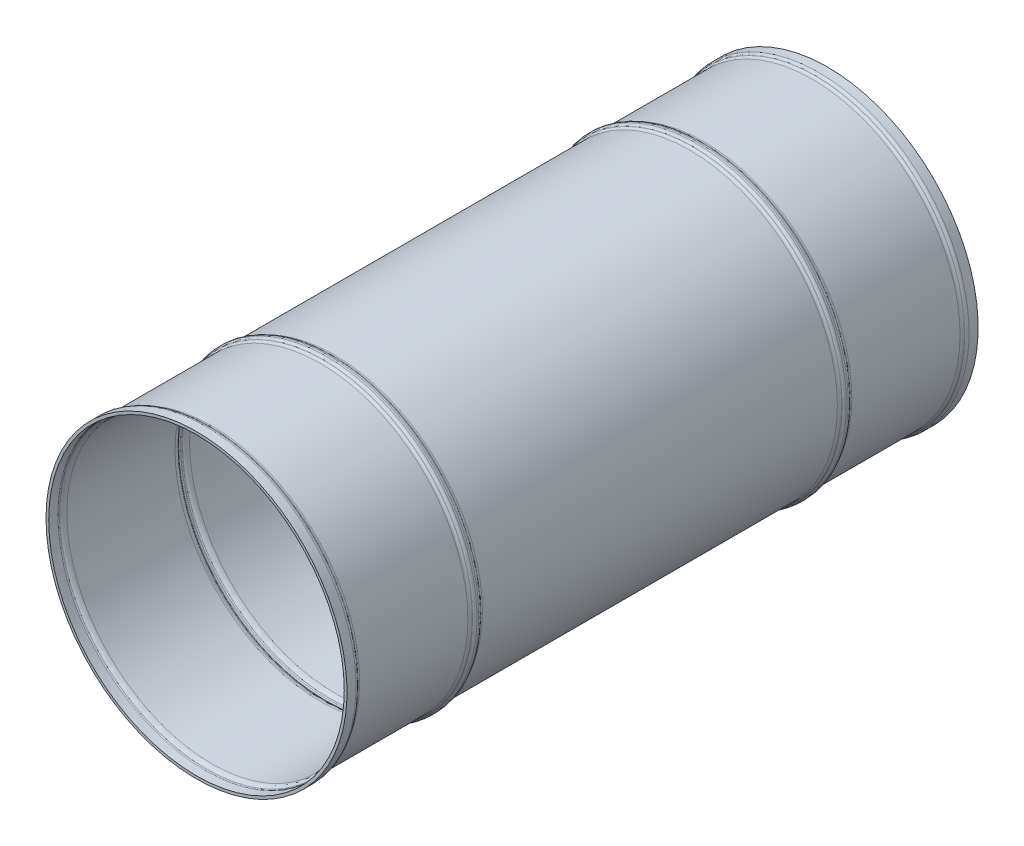
ISO-10303-21;
HEADER;
FILE_DESCRIPTION(('STEP AP214'),'2;1');
FILE_NAME('part.step','',(''),(''),'','','');
FILE_SCHEMA(('AUTOMOTIVE_DESIGN { 1 0 10303 214 1 1 1 1 }'));
ENDSEC;
DATA;
#1=APPLICATION_CONTEXT('core data for automotive mechanical design processes');
#2=APPLICATION_PROTOCOL_DEFINITION('international standard','automotive_design',2000,#1);
#3=PRODUCT_CONTEXT('',#1,'mechanical');
#4=PRODUCT('Part','Part','',(#3));
#5=PRODUCT_RELATED_PRODUCT_CATEGORY('part','',(#4));
#6=PRODUCT_DEFINITION_FORMATION('','',#4);
#7=PRODUCT_DEFINITION_CONTEXT('part definition',#1,'design');
#8=PRODUCT_DEFINITION('design','',#6,#7);
#9=PRODUCT_DEFINITION_SHAPE('','',#8);
#10=(LENGTH_UNIT() NAMED_UNIT(*) SI_UNIT(.MILLI.,.METRE.));
#11=(NAMED_UNIT(*) PLANE_ANGLE_UNIT() SI_UNIT($,.RADIAN.));
#12=(NAMED_UNIT(*) SI_UNIT($,.STERADIAN.) SOLID_ANGLE_UNIT());
#13=UNCERTAINTY_MEASURE_WITH_UNIT(LENGTH_MEASURE(1.E-05),#10,'distance_accuracy_value','');
#14=(GEOMETRIC_REPRESENTATION_CONTEXT(3) GLOBAL_UNCERTAINTY_ASSIGNED_CONTEXT((#13)) GLOBAL_UNIT_ASSIGNED_CONTEXT((#10,
#11,#12)) REPRESENTATION_CONTEXT('',''));
#15=CARTESIAN_POINT('',(0.,0.,0.));
#16=DIRECTION('',(0.,0.,1.));
#17=DIRECTION('',(1.,0.,0.));
#18=AXIS2_PLACEMENT_3D('',#15,#16,#17);
#19=CARTESIAN_POINT('',(0.,27.7,91.0884572681201));
#20=DIRECTION('',(0.,0.,1.));
#21=DIRECTION('',(1.,0.,0.));
#22=AXIS2_PLACEMENT_3D('',#19,#20,#21);
#23=PLANE('',#22);
#24=CARTESIAN_POINT('',(0.,0.,91.0884572681201));
#25=DIRECTION('',(0.,0.,-1.));
#26=DIRECTION('',(-1.,0.,0.));
#27=AXIS2_PLACEMENT_3D('',#24,#25,#26);
#28=CIRCLE('',#27,27.2);
#29=CARTESIAN_POINT('',(-27.2,0.,91.0884572681201));
#30=VERTEX_POINT('',#29);
#31=EDGE_CURVE('E192',#30,#30,#28,.T.);
#32=ORIENTED_EDGE('',*,*,#31,.T.);
#33=EDGE_LOOP('',(#32));
#34=FACE_BOUND('',#33,.T.);
#35=CARTESIAN_POINT('',(0.,0.,91.0884572681201));
#36=DIRECTION('',(0.,0.,-1.));
#37=DIRECTION('',(-1.,0.,0.));
#38=AXIS2_PLACEMENT_3D('',#35,#36,#37);
#39=CIRCLE('',#38,27.7);
#40=CARTESIAN_POINT('',(-27.7,0.,91.0884572681201));
#41=VERTEX_POINT('',#40);
#42=EDGE_CURVE('E10',#41,#41,#39,.T.);
#43=ORIENTED_EDGE('',*,*,#42,.F.);
#44=EDGE_LOOP('',(#43));
#45=FACE_BOUND('',#44,.T.);
#46=ADVANCED_FACE('F32',(#34,#45),#23,.T.);
#47=CARTESIAN_POINT('',(0.,0.,0.));
#48=DIRECTION('',(0.,0.,-1.));
#49=DIRECTION('',(-1.,0.,0.));
#50=AXIS2_PLACEMENT_3D('',#47,#48,#49);
#51=CYLINDRICAL_SURFACE('',#50,27.7);
#52=ORIENTED_EDGE('',*,*,#42,.T.);
#53=EDGE_LOOP('',(#52));
#54=FACE_BOUND('',#53,.T.);
#55=CARTESIAN_POINT('',(0.,0.,89.4198281180186));
#56=DIRECTION('',(0.,0.,-1.));
#57=DIRECTION('',(-1.,0.,0.));
#58=AXIS2_PLACEMENT_3D('',#55,#56,#57);
#59=CIRCLE('',#58,27.7);
#60=CARTESIAN_POINT('',(-27.7,0.,89.4198281180186));
#61=VERTEX_POINT('',#60);
#62=EDGE_CURVE('E38',#61,#61,#59,.T.);
#63=ORIENTED_EDGE('',*,*,#62,.F.);
#64=EDGE_LOOP('',(#63));
#65=FACE_BOUND('',#64,.T.);
#66=ADVANCED_FACE('F210',(#54,#65),#51,.T.);
#67=CARTESIAN_POINT('',(0.,0.,89.4198281180186));
#68=DIRECTION('',(0.,0.,-1.));
#69=DIRECTION('',(-1.,0.,0.));
#70=AXIS2_PLACEMENT_3D('',#67,#68,#69);
#71=TOROIDAL_SURFACE('',#70,26.9,0.799999999999999);
#72=ORIENTED_EDGE('',*,*,#62,.T.);
#73=EDGE_LOOP('',(#72));
#74=FACE_BOUND('',#73,.T.);
#75=CARTESIAN_POINT('',(0.,0.,88.8541426930694));
#76=DIRECTION('',(0.,0.,-1.));
#77=DIRECTION('',(-1.,0.,0.));
#78=AXIS2_PLACEMENT_3D('',#75,#76,#77);
#79=CIRCLE('',#78,27.4656854249492);
#80=CARTESIAN_POINT('',(-27.4656854249492,0.,88.8541426930694));
#81=VERTEX_POINT('',#80);
#82=EDGE_CURVE('E42',#81,#81,#79,.T.);
#83=ORIENTED_EDGE('',*,*,#82,.F.);
#84=EDGE_LOOP('',(#83));
#85=FACE_BOUND('',#84,.T.);
#86=ADVANCED_FACE('F214',(#74,#85),#71,.T.);
#87=CARTESIAN_POINT('',(0.,0.,88.8227718431709));
#88=DIRECTION('',(0.,0.,1.));
#89=DIRECTION('',(1.,0.,0.));
#90=AXIS2_PLACEMENT_3D('',#87,#88,#89);
#91=CONICAL_SURFACE('',#90,27.4343145750507,0.785398163397338);
#92=ORIENTED_EDGE('',*,*,#82,.T.);
#93=EDGE_LOOP('',(#92));
#94=FACE_BOUND('',#93,.T.);
#95=CARTESIAN_POINT('',(0.,0.,88.8227718431709));
#96=DIRECTION('',(0.,0.,-1.));
#97=DIRECTION('',(-1.,0.,0.));
#98=AXIS2_PLACEMENT_3D('',#95,#96,#97);
#99=CIRCLE('',#98,27.4343145750507);
#100=CARTESIAN_POINT('',(-27.4343145750507,0.,88.8227718431709));
#101=VERTEX_POINT('',#100);
#102=EDGE_CURVE('E46',#101,#101,#99,.T.);
#103=ORIENTED_EDGE('',*,*,#102,.F.);
#104=EDGE_LOOP('',(#103));
#105=FACE_BOUND('',#104,.T.);
#106=ADVANCED_FACE('F218',(#94,#105),#91,.T.);
#107=CARTESIAN_POINT('',(0.,0.,88.2570864182216));
#108=DIRECTION('',(0.,0.,-1.));
#109=DIRECTION('',(-1.,0.,0.));
#110=AXIS2_PLACEMENT_3D('',#107,#108,#109);
#111=TOROIDAL_SURFACE('',#110,28.,0.799999999999996);
#112=ORIENTED_EDGE('',*,*,#102,.T.);
#113=EDGE_LOOP('',(#112));
#114=FACE_BOUND('',#113,.T.);
#115=CARTESIAN_POINT('',(0.,0.,88.2570864182216));
#116=DIRECTION('',(0.,0.,-1.));
#117=DIRECTION('',(-1.,0.,0.));
#118=AXIS2_PLACEMENT_3D('',#115,#116,#117);
#119=CIRCLE('',#118,27.2);
#120=CARTESIAN_POINT('',(-27.2,0.,88.2570864182216));
#121=VERTEX_POINT('',#120);
#122=EDGE_CURVE('E51',#121,#121,#119,.T.);
#123=ORIENTED_EDGE('',*,*,#122,.F.);
#124=EDGE_LOOP('',(#123));
#125=FACE_BOUND('',#124,.T.);
#126=ADVANCED_FACE('F224',(#114,#125),#111,.F.);
#127=CARTESIAN_POINT('',(0.,0.,0.));
#128=DIRECTION('',(0.,0.,-1.));
#129=DIRECTION('',(-1.,0.,0.));
#130=AXIS2_PLACEMENT_3D('',#127,#128,#129);
#131=CYLINDRICAL_SURFACE('',#130,27.2);
#132=ORIENTED_EDGE('',*,*,#122,.T.);
#133=EDGE_LOOP('',(#132));
#134=FACE_BOUND('',#133,.T.);
#135=CARTESIAN_POINT('',(0.,0.,68.3313708498985));
#136=DIRECTION('',(0.,0.,-1.));
#137=DIRECTION('',(-1.,0.,0.));
#138=AXIS2_PLACEMENT_3D('',#135,#136,#137);
#139=CIRCLE('',#138,27.2);
#140=CARTESIAN_POINT('',(-27.2,0.,68.3313708498985));
#141=VERTEX_POINT('',#140);
#142=EDGE_CURVE('E54',#141,#141,#139,.T.);
#143=ORIENTED_EDGE('',*,*,#142,.F.);
#144=EDGE_LOOP('',(#143));
#145=FACE_BOUND('',#144,.T.);
#146=ADVANCED_FACE('F228',(#134,#145),#131,.T.);
#147=CARTESIAN_POINT('',(0.,0.,68.3313708498985));
#148=DIRECTION('',(0.,0.,-1.));
#149=DIRECTION('',(-1.,0.,0.));
#150=AXIS2_PLACEMENT_3D('',#147,#148,#149);
#151=TOROIDAL_SURFACE('',#150,28.,0.800000000000001);
#152=ORIENTED_EDGE('',*,*,#142,.T.);
#153=EDGE_LOOP('',(#152));
#154=FACE_BOUND('',#153,.T.);
#155=CARTESIAN_POINT('',(0.,0.,67.7656854249492));
#156=DIRECTION('',(0.,0.,-1.));
#157=DIRECTION('',(-1.,0.,0.));
#158=AXIS2_PLACEMENT_3D('',#155,#156,#157);
#159=CIRCLE('',#158,27.4343145750508);
#160=CARTESIAN_POINT('',(-27.4343145750508,0.,67.7656854249492));
#161=VERTEX_POINT('',#160);
#162=EDGE_CURVE('E57',#161,#161,#159,.T.);
#163=ORIENTED_EDGE('',*,*,#162,.F.);
#164=EDGE_LOOP('',(#163));
#165=FACE_BOUND('',#164,.T.);
#166=ADVANCED_FACE('F232',(#154,#165),#151,.F.);
#167=CARTESIAN_POINT('',(0.,0.,67.7343145750508));
#168=DIRECTION('',(0.,0.,-1.));
#169=DIRECTION('',(-1.,0.,0.));
#170=AXIS2_PLACEMENT_3D('',#167,#168,#169);
#171=CONICAL_SURFACE('',#170,27.4656854249492,0.785398163397448);
#172=ORIENTED_EDGE('',*,*,#162,.T.);
#173=EDGE_LOOP('',(#172));
#174=FACE_BOUND('',#173,.T.);
#175=CARTESIAN_POINT('',(0.,0.,67.7343145750508));
#176=DIRECTION('',(0.,0.,-1.));
#177=DIRECTION('',(-1.,0.,0.));
#178=AXIS2_PLACEMENT_3D('',#175,#176,#177);
#179=CIRCLE('',#178,27.4656854249492);
#180=CARTESIAN_POINT('',(-27.4656854249492,0.,67.7343145750508));
#181=VERTEX_POINT('',#180);
#182=EDGE_CURVE('E60',#181,#181,#179,.T.);
#183=ORIENTED_EDGE('',*,*,#182,.F.);
#184=EDGE_LOOP('',(#183));
#185=FACE_BOUND('',#184,.T.);
#186=ADVANCED_FACE('F236',(#174,#185),#171,.T.);
#187=CARTESIAN_POINT('',(0.,0.,67.1686291501015));
#188=DIRECTION('',(0.,0.,-1.));
#189=DIRECTION('',(-1.,0.,0.));
#190=AXIS2_PLACEMENT_3D('',#187,#188,#189);
#191=TOROIDAL_SURFACE('',#190,26.9,0.799999999999999);
#192=ORIENTED_EDGE('',*,*,#182,.T.);
#193=EDGE_LOOP('',(#192));
#194=FACE_BOUND('',#193,.T.);
#195=CARTESIAN_POINT('',(0.,0.,67.1686291501015));
#196=DIRECTION('',(0.,0.,-1.));
#197=DIRECTION('',(-1.,0.,0.));
#198=AXIS2_PLACEMENT_3D('',#195,#196,#197);
#199=CIRCLE('',#198,27.7);
#200=CARTESIAN_POINT('',(-27.7,0.,67.1686291501015));
#201=VERTEX_POINT('',#200);
#202=EDGE_CURVE('E63',#201,#201,#199,.T.);
#203=ORIENTED_EDGE('',*,*,#202,.F.);
#204=EDGE_LOOP('',(#203));
#205=FACE_BOUND('',#204,.T.);
#206=ADVANCED_FACE('F240',(#194,#205),#191,.T.);
#207=CARTESIAN_POINT('',(0.,0.,0.));
#208=DIRECTION('',(0.,0.,-1.));
#209=DIRECTION('',(-1.,0.,0.));
#210=AXIS2_PLACEMENT_3D('',#207,#208,#209);
#211=CYLINDRICAL_SURFACE('',#210,27.7);
#212=ORIENTED_EDGE('',*,*,#202,.T.);
#213=EDGE_LOOP('',(#212));
#214=FACE_BOUND('',#213,.T.);
#215=CARTESIAN_POINT('',(0.,0.,66.8313708498985));
#216=DIRECTION('',(0.,0.,-1.));
#217=DIRECTION('',(-1.,0.,0.));
#218=AXIS2_PLACEMENT_3D('',#215,#216,#217);
#219=CIRCLE('',#218,27.7);
#220=CARTESIAN_POINT('',(-27.7,0.,66.8313708498985));
#221=VERTEX_POINT('',#220);
#222=EDGE_CURVE('E66',#221,#221,#219,.T.);
#223=ORIENTED_EDGE('',*,*,#222,.F.);
#224=EDGE_LOOP('',(#223));
#225=FACE_BOUND('',#224,.T.);
#226=ADVANCED_FACE('F244',(#214,#225),#211,.T.);
#227=CARTESIAN_POINT('',(0.,0.,66.8313708498985));
#228=DIRECTION('',(0.,0.,-1.));
#229=DIRECTION('',(-1.,0.,0.));
#230=AXIS2_PLACEMENT_3D('',#227,#228,#229);
#231=TOROIDAL_SURFACE('',#230,26.9,0.799999999999997);
#232=ORIENTED_EDGE('',*,*,#222,.T.);
#233=EDGE_LOOP('',(#232));
#234=FACE_BOUND('',#233,.T.);
#235=CARTESIAN_POINT('',(0.,0.,66.2656854249493));
#236=DIRECTION('',(0.,0.,-1.));
#237=DIRECTION('',(-1.,0.,0.));
#238=AXIS2_PLACEMENT_3D('',#235,#236,#237);
#239=CIRCLE('',#238,27.4656854249492);
#240=CARTESIAN_POINT('',(-27.4656854249492,0.,66.2656854249493));
#241=VERTEX_POINT('',#240);
#242=EDGE_CURVE('E69',#241,#241,#239,.T.);
#243=ORIENTED_EDGE('',*,*,#242,.F.);
#244=EDGE_LOOP('',(#243));
#245=FACE_BOUND('',#244,.T.);
#246=ADVANCED_FACE('F248',(#234,#245),#231,.T.);
#247=CARTESIAN_POINT('',(0.,0.,66.2343145750508));
#248=DIRECTION('',(0.,0.,1.));
#249=DIRECTION('',(1.,0.,0.));
#250=AXIS2_PLACEMENT_3D('',#247,#248,#249);
#251=CONICAL_SURFACE('',#250,27.4343145750507,0.785398163397338);
#252=ORIENTED_EDGE('',*,*,#242,.T.);
#253=EDGE_LOOP('',(#252));
#254=FACE_BOUND('',#253,.T.);
#255=CARTESIAN_POINT('',(0.,0.,66.2343145750508));
#256=DIRECTION('',(0.,0.,-1.));
#257=DIRECTION('',(-1.,0.,0.));
#258=AXIS2_PLACEMENT_3D('',#255,#256,#257);
#259=CIRCLE('',#258,27.4343145750507);
#260=CARTESIAN_POINT('',(-27.4343145750507,0.,66.2343145750508));
#261=VERTEX_POINT('',#260);
#262=EDGE_CURVE('E72',#261,#261,#259,.T.);
#263=ORIENTED_EDGE('',*,*,#262,.F.);
#264=EDGE_LOOP('',(#263));
#265=FACE_BOUND('',#264,.T.);
#266=ADVANCED_FACE('F252',(#254,#265),#251,.T.);
#267=CARTESIAN_POINT('',(0.,0.,65.6686291501015));
#268=DIRECTION('',(0.,0.,-1.));
#269=DIRECTION('',(-1.,0.,0.));
#270=AXIS2_PLACEMENT_3D('',#267,#268,#269);
#271=TOROIDAL_SURFACE('',#270,28.,0.799999999999999);
#272=ORIENTED_EDGE('',*,*,#262,.T.);
#273=EDGE_LOOP('',(#272));
#274=FACE_BOUND('',#273,.T.);
#275=CARTESIAN_POINT('',(0.,0.,65.6686291501015));
#276=DIRECTION('',(0.,0.,-1.));
#277=DIRECTION('',(-1.,0.,0.));
#278=AXIS2_PLACEMENT_3D('',#275,#276,#277);
#279=CIRCLE('',#278,27.2);
#280=CARTESIAN_POINT('',(-27.2,0.,65.6686291501015));
#281=VERTEX_POINT('',#280);
#282=EDGE_CURVE('E75',#281,#281,#279,.T.);
#283=ORIENTED_EDGE('',*,*,#282,.F.);
#284=EDGE_LOOP('',(#283));
#285=FACE_BOUND('',#284,.T.);
#286=ADVANCED_FACE('F256',(#274,#285),#271,.F.);
#287=CARTESIAN_POINT('',(0.,0.,0.));
#288=DIRECTION('',(0.,0.,-1.));
#289=DIRECTION('',(-1.,0.,0.));
#290=AXIS2_PLACEMENT_3D('',#287,#288,#289);
#291=CYLINDRICAL_SURFACE('',#290,27.2);
#292=ORIENTED_EDGE('',*,*,#282,.T.);
#293=EDGE_LOOP('',(#292));
#294=FACE_BOUND('',#293,.T.);
#295=CARTESIAN_POINT('',(0.,0.,0.331370849898465));
#296=DIRECTION('',(0.,0.,-1.));
#297=DIRECTION('',(-1.,0.,0.));
#298=AXIS2_PLACEMENT_3D('',#295,#296,#297);
#299=CIRCLE('',#298,27.2);
#300=CARTESIAN_POINT('',(-27.2,0.,0.331370849898465));
#301=VERTEX_POINT('',#300);
#302=EDGE_CURVE('E78',#301,#301,#299,.T.);
#303=ORIENTED_EDGE('',*,*,#302,.F.);
#304=EDGE_LOOP('',(#303));
#305=FACE_BOUND('',#304,.T.);
#306=ADVANCED_FACE('F260',(#294,#305),#291,.T.);
#307=CARTESIAN_POINT('',(0.,0.,0.331370849898462));
#308=DIRECTION('',(0.,0.,-1.));
#309=DIRECTION('',(-1.,0.,0.));
#310=AXIS2_PLACEMENT_3D('',#307,#308,#309);
#311=TOROIDAL_SURFACE('',#310,28.,0.799999999999999);
#312=ORIENTED_EDGE('',*,*,#302,.T.);
#313=EDGE_LOOP('',(#312));
#314=FACE_BOUND('',#313,.T.);
#315=CARTESIAN_POINT('',(0.,0.,-0.234314575050761));
#316=DIRECTION('',(0.,0.,-1.));
#317=DIRECTION('',(-1.,0.,0.));
#318=AXIS2_PLACEMENT_3D('',#315,#316,#317);
#319=CIRCLE('',#318,27.4343145750507);
#320=CARTESIAN_POINT('',(-27.4343145750507,0.,-0.234314575050761));
#321=VERTEX_POINT('',#320);
#322=EDGE_CURVE('E81',#321,#321,#319,.T.);
#323=ORIENTED_EDGE('',*,*,#322,.F.);
#324=EDGE_LOOP('',(#323));
#325=FACE_BOUND('',#324,.T.);
#326=ADVANCED_FACE('F264',(#314,#325),#311,.F.);
#327=CARTESIAN_POINT('',(0.,0.,-0.265685424949239));
#328=DIRECTION('',(0.,0.,-1.));
#329=DIRECTION('',(-1.,0.,0.));
#330=AXIS2_PLACEMENT_3D('',#327,#328,#329);
#331=CONICAL_SURFACE('',#330,27.4656854249492,0.78539816339743);
#332=ORIENTED_EDGE('',*,*,#322,.T.);
#333=EDGE_LOOP('',(#332));
#334=FACE_BOUND('',#333,.T.);
#335=CARTESIAN_POINT('',(0.,0.,-0.265685424949239));
#336=DIRECTION('',(0.,0.,-1.));
#337=DIRECTION('',(-1.,0.,0.));
#338=AXIS2_PLACEMENT_3D('',#335,#336,#337);
#339=CIRCLE('',#338,27.4656854249492);
#340=CARTESIAN_POINT('',(-27.4656854249492,0.,-0.265685424949239));
#341=VERTEX_POINT('',#340);
#342=EDGE_CURVE('E84',#341,#341,#339,.T.);
#343=ORIENTED_EDGE('',*,*,#342,.F.);
#344=EDGE_LOOP('',(#343));
#345=FACE_BOUND('',#344,.T.);
#346=ADVANCED_FACE('F268',(#334,#345),#331,.T.);
#347=CARTESIAN_POINT('',(0.,0.,-0.831370849898462));
#348=DIRECTION('',(0.,0.,-1.));
#349=DIRECTION('',(-1.,0.,0.));
#350=AXIS2_PLACEMENT_3D('',#347,#348,#349);
#351=TOROIDAL_SURFACE('',#350,26.9,0.799999999999999);
#352=ORIENTED_EDGE('',*,*,#342,.T.);
#353=EDGE_LOOP('',(#352));
#354=FACE_BOUND('',#353,.T.);
#355=CARTESIAN_POINT('',(0.,0.,-0.831370849898465));
#356=DIRECTION('',(0.,0.,-1.));
#357=DIRECTION('',(-1.,0.,0.));
#358=AXIS2_PLACEMENT_3D('',#355,#356,#357);
#359=CIRCLE('',#358,27.7);
#360=CARTESIAN_POINT('',(-27.7,0.,-0.831370849898465));
#361=VERTEX_POINT('',#360);
#362=EDGE_CURVE('E87',#361,#361,#359,.T.);
#363=ORIENTED_EDGE('',*,*,#362,.F.);
#364=EDGE_LOOP('',(#363));
#365=FACE_BOUND('',#364,.T.);
#366=ADVANCED_FACE('F272',(#354,#365),#351,.T.);
#367=CARTESIAN_POINT('',(0.,0.,0.));
#368=DIRECTION('',(0.,0.,-1.));
#369=DIRECTION('',(-1.,0.,0.));
#370=AXIS2_PLACEMENT_3D('',#367,#368,#369);
#371=CYLINDRICAL_SURFACE('',#370,27.7);
#372=ORIENTED_EDGE('',*,*,#362,.T.);
#373=EDGE_LOOP('',(#372));
#374=FACE_BOUND('',#373,.T.);
#375=CARTESIAN_POINT('',(0.,0.,-1.16862915010151));
#376=DIRECTION('',(0.,0.,-1.));
#377=DIRECTION('',(-1.,0.,0.));
#378=AXIS2_PLACEMENT_3D('',#375,#376,#377);
#379=CIRCLE('',#378,27.7);
#380=CARTESIAN_POINT('',(-27.7,0.,-1.16862915010151));
#381=VERTEX_POINT('',#380);
#382=EDGE_CURVE('E90',#381,#381,#379,.T.);
#383=ORIENTED_EDGE('',*,*,#382,.F.);
#384=EDGE_LOOP('',(#383));
#385=FACE_BOUND('',#384,.T.);
#386=ADVANCED_FACE('F276',(#374,#385),#371,.T.);
#387=CARTESIAN_POINT('',(0.,0.,-1.16862915010151));
#388=DIRECTION('',(0.,0.,-1.));
#389=DIRECTION('',(-1.,0.,0.));
#390=AXIS2_PLACEMENT_3D('',#387,#388,#389);
#391=TOROIDAL_SURFACE('',#390,26.9,0.799999999999999);
#392=ORIENTED_EDGE('',*,*,#382,.T.);
#393=EDGE_LOOP('',(#392));
#394=FACE_BOUND('',#393,.T.);
#395=CARTESIAN_POINT('',(0.,0.,-1.73431457505077));
#396=DIRECTION('',(0.,0.,-1.));
#397=DIRECTION('',(-1.,0.,0.));
#398=AXIS2_PLACEMENT_3D('',#395,#396,#397);
#399=CIRCLE('',#398,27.4656854249492);
#400=CARTESIAN_POINT('',(-27.4656854249492,0.,-1.73431457505077));
#401=VERTEX_POINT('',#400);
#402=EDGE_CURVE('E93',#401,#401,#399,.T.);
#403=ORIENTED_EDGE('',*,*,#402,.F.);
#404=EDGE_LOOP('',(#403));
#405=FACE_BOUND('',#404,.T.);
#406=ADVANCED_FACE('F280',(#394,#405),#391,.T.);
#407=CARTESIAN_POINT('',(0.,0.,-1.76568542494921));
#408=DIRECTION('',(0.,0.,1.));
#409=DIRECTION('',(1.,0.,0.));
#410=AXIS2_PLACEMENT_3D('',#407,#408,#409);
#411=CONICAL_SURFACE('',#410,27.4343145750507,0.785398163397493);
#412=ORIENTED_EDGE('',*,*,#402,.T.);
#413=EDGE_LOOP('',(#412));
#414=FACE_BOUND('',#413,.T.);
#415=CARTESIAN_POINT('',(0.,0.,-1.76568542494921));
#416=DIRECTION('',(0.,0.,-1.));
#417=DIRECTION('',(-1.,0.,0.));
#418=AXIS2_PLACEMENT_3D('',#415,#416,#417);
#419=CIRCLE('',#418,27.4343145750507);
#420=CARTESIAN_POINT('',(-27.4343145750507,0.,-1.76568542494921));
#421=VERTEX_POINT('',#420);
#422=EDGE_CURVE('E96',#421,#421,#419,.T.);
#423=ORIENTED_EDGE('',*,*,#422,.F.);
#424=EDGE_LOOP('',(#423));
#425=FACE_BOUND('',#424,.T.);
#426=ADVANCED_FACE('F284',(#414,#425),#411,.T.);
#427=CARTESIAN_POINT('',(0.,0.,-2.33137084989846));
#428=DIRECTION('',(0.,0.,-1.));
#429=DIRECTION('',(-1.,0.,0.));
#430=AXIS2_PLACEMENT_3D('',#427,#428,#429);
#431=TOROIDAL_SURFACE('',#430,28.,0.799999999999999);
#432=ORIENTED_EDGE('',*,*,#422,.T.);
#433=EDGE_LOOP('',(#432));
#434=FACE_BOUND('',#433,.T.);
#435=CARTESIAN_POINT('',(0.,0.,-2.33137084989847));
#436=DIRECTION('',(0.,0.,-1.));
#437=DIRECTION('',(-1.,0.,0.));
#438=AXIS2_PLACEMENT_3D('',#435,#436,#437);
#439=CIRCLE('',#438,27.2);
#440=CARTESIAN_POINT('',(-27.2,0.,-2.33137084989847));
#441=VERTEX_POINT('',#440);
#442=EDGE_CURVE('E99',#441,#441,#439,.T.);
#443=ORIENTED_EDGE('',*,*,#442,.F.);
#444=EDGE_LOOP('',(#443));
#445=FACE_BOUND('',#444,.T.);
#446=ADVANCED_FACE('F288',(#434,#445),#431,.F.);
#447=CARTESIAN_POINT('',(0.,0.,0.));
#448=DIRECTION('',(0.,0.,-1.));
#449=DIRECTION('',(-1.,0.,0.));
#450=AXIS2_PLACEMENT_3D('',#447,#448,#449);
#451=CYLINDRICAL_SURFACE('',#450,27.2);
#452=ORIENTED_EDGE('',*,*,#442,.T.);
#453=EDGE_LOOP('',(#452));
#454=FACE_BOUND('',#453,.T.);
#455=CARTESIAN_POINT('',(0.,0.,-22.2570864182216));
#456=DIRECTION('',(0.,0.,-1.));
#457=DIRECTION('',(-1.,0.,0.));
#458=AXIS2_PLACEMENT_3D('',#455,#456,#457);
#459=CIRCLE('',#458,27.2);
#460=CARTESIAN_POINT('',(-27.2,0.,-22.2570864182216));
#461=VERTEX_POINT('',#460);
#462=EDGE_CURVE('E102',#461,#461,#459,.T.);
#463=ORIENTED_EDGE('',*,*,#462,.F.);
#464=EDGE_LOOP('',(#463));
#465=FACE_BOUND('',#464,.T.);
#466=ADVANCED_FACE('F292',(#454,#465),#451,.T.);
#467=CARTESIAN_POINT('',(0.,0.,-22.2570864182216));
#468=DIRECTION('',(0.,0.,-1.));
#469=DIRECTION('',(-1.,0.,0.));
#470=AXIS2_PLACEMENT_3D('',#467,#468,#469);
#471=TOROIDAL_SURFACE('',#470,28.,0.799999999999999);
#472=ORIENTED_EDGE('',*,*,#462,.T.);
#473=EDGE_LOOP('',(#472));
#474=FACE_BOUND('',#473,.T.);
#475=CARTESIAN_POINT('',(0.,0.,-22.8227718431709));
#476=DIRECTION('',(0.,0.,-1.));
#477=DIRECTION('',(-1.,0.,0.));
#478=AXIS2_PLACEMENT_3D('',#475,#476,#477);
#479=CIRCLE('',#478,27.4343145750507);
#480=CARTESIAN_POINT('',(-27.4343145750507,0.,-22.8227718431709));
#481=VERTEX_POINT('',#480);
#482=EDGE_CURVE('E105',#481,#481,#479,.T.);
#483=ORIENTED_EDGE('',*,*,#482,.F.);
#484=EDGE_LOOP('',(#483));
#485=FACE_BOUND('',#484,.T.);
#486=ADVANCED_FACE('F296',(#474,#485),#471,.F.);
#487=CARTESIAN_POINT('',(0.,0.,-22.8541426930694));
#488=DIRECTION('',(0.,0.,-1.));
#489=DIRECTION('',(-1.,0.,0.));
#490=AXIS2_PLACEMENT_3D('',#487,#488,#489);
#491=CONICAL_SURFACE('',#490,27.4656854249492,0.785398163397448);
#492=ORIENTED_EDGE('',*,*,#482,.T.);
#493=EDGE_LOOP('',(#492));
#494=FACE_BOUND('',#493,.T.);
#495=CARTESIAN_POINT('',(0.,0.,-22.8541426930694));
#496=DIRECTION('',(0.,0.,-1.));
#497=DIRECTION('',(-1.,0.,0.));
#498=AXIS2_PLACEMENT_3D('',#495,#496,#497);
#499=CIRCLE('',#498,27.4656854249492);
#500=CARTESIAN_POINT('',(-27.4656854249492,0.,-22.8541426930694));
#501=VERTEX_POINT('',#500);
#502=EDGE_CURVE('E108',#501,#501,#499,.T.);
#503=ORIENTED_EDGE('',*,*,#502,.F.);
#504=EDGE_LOOP('',(#503));
#505=FACE_BOUND('',#504,.T.);
#506=ADVANCED_FACE('F300',(#494,#505),#491,.T.);
#507=CARTESIAN_POINT('',(0.,0.,-23.4198281180186));
#508=DIRECTION('',(0.,0.,-1.));
#509=DIRECTION('',(-1.,0.,0.));
#510=AXIS2_PLACEMENT_3D('',#507,#508,#509);
#511=TOROIDAL_SURFACE('',#510,26.9,0.800000000000002);
#512=ORIENTED_EDGE('',*,*,#502,.T.);
#513=EDGE_LOOP('',(#512));
#514=FACE_BOUND('',#513,.T.);
#515=CARTESIAN_POINT('',(0.,0.,-23.4198281180186));
#516=DIRECTION('',(0.,0.,-1.));
#517=DIRECTION('',(-1.,0.,0.));
#518=AXIS2_PLACEMENT_3D('',#515,#516,#517);
#519=CIRCLE('',#518,27.7);
#520=CARTESIAN_POINT('',(-27.7,0.,-23.4198281180186));
#521=VERTEX_POINT('',#520);
#522=EDGE_CURVE('E111',#521,#521,#519,.T.);
#523=ORIENTED_EDGE('',*,*,#522,.F.);
#524=EDGE_LOOP('',(#523));
#525=FACE_BOUND('',#524,.T.);
#526=ADVANCED_FACE('F304',(#514,#525),#511,.T.);
#527=CARTESIAN_POINT('',(0.,0.,0.));
#528=DIRECTION('',(0.,0.,-1.));
#529=DIRECTION('',(-1.,0.,0.));
#530=AXIS2_PLACEMENT_3D('',#527,#528,#529);
#531=CYLINDRICAL_SURFACE('',#530,27.7);
#532=ORIENTED_EDGE('',*,*,#522,.T.);
#533=EDGE_LOOP('',(#532));
#534=FACE_BOUND('',#533,.T.);
#535=CARTESIAN_POINT('',(0.,0.,-25.0884572681201));
#536=DIRECTION('',(0.,0.,-1.));
#537=DIRECTION('',(-1.,0.,0.));
#538=AXIS2_PLACEMENT_3D('',#535,#536,#537);
#539=CIRCLE('',#538,27.7);
#540=CARTESIAN_POINT('',(-27.7,0.,-25.0884572681201));
#541=VERTEX_POINT('',#540);
#542=EDGE_CURVE('E114',#541,#541,#539,.T.);
#543=ORIENTED_EDGE('',*,*,#542,.F.);
#544=EDGE_LOOP('',(#543));
#545=FACE_BOUND('',#544,.T.);
#546=ADVANCED_FACE('F308',(#534,#545),#531,.T.);
#547=CARTESIAN_POINT('',(0.,27.7,-25.0884572681201));
#548=DIRECTION('',(0.,0.,-1.));
#549=DIRECTION('',(-1.,0.,0.));
#550=AXIS2_PLACEMENT_3D('',#547,#548,#549);
#551=PLANE('',#550);
#552=ORIENTED_EDGE('',*,*,#542,.T.);
#553=EDGE_LOOP('',(#552));
#554=FACE_BOUND('',#553,.T.);
#555=CARTESIAN_POINT('',(0.,0.,-25.0884572681201));
#556=DIRECTION('',(0.,0.,-1.));
#557=DIRECTION('',(-1.,0.,0.));
#558=AXIS2_PLACEMENT_3D('',#555,#556,#557);
#559=CIRCLE('',#558,27.2);
#560=CARTESIAN_POINT('',(-27.2,0.,-25.0884572681201));
#561=VERTEX_POINT('',#560);
#562=EDGE_CURVE('E117',#561,#561,#559,.T.);
#563=ORIENTED_EDGE('',*,*,#562,.F.);
#564=EDGE_LOOP('',(#563));
#565=FACE_BOUND('',#564,.T.);
#566=ADVANCED_FACE('F312',(#554,#565),#551,.T.);
#567=CARTESIAN_POINT('',(0.,0.,0.));
#568=DIRECTION('',(0.,0.,-1.));
#569=DIRECTION('',(-1.,0.,0.));
#570=AXIS2_PLACEMENT_3D('',#567,#568,#569);
#571=CYLINDRICAL_SURFACE('',#570,27.2);
#572=ORIENTED_EDGE('',*,*,#562,.T.);
#573=EDGE_LOOP('',(#572));
#574=FACE_BOUND('',#573,.T.);
#575=CARTESIAN_POINT('',(0.,0.,-23.4198281180186));
#576=DIRECTION('',(0.,0.,-1.));
#577=DIRECTION('',(-1.,0.,0.));
#578=AXIS2_PLACEMENT_3D('',#575,#576,#577);
#579=CIRCLE('',#578,27.2);
#580=CARTESIAN_POINT('',(-27.2,0.,-23.4198281180186));
#581=VERTEX_POINT('',#580);
#582=EDGE_CURVE('E120',#581,#581,#579,.T.);
#583=ORIENTED_EDGE('',*,*,#582,.F.);
#584=EDGE_LOOP('',(#583));
#585=FACE_BOUND('',#584,.T.);
#586=ADVANCED_FACE('F316',(#574,#585),#571,.F.);
#587=CARTESIAN_POINT('',(0.,0.,-23.4198281180186));
#588=DIRECTION('',(0.,0.,-1.));
#589=DIRECTION('',(-1.,0.,0.));
#590=AXIS2_PLACEMENT_3D('',#587,#588,#589);
#591=TOROIDAL_SURFACE('',#590,26.9,0.300000000000002);
#592=ORIENTED_EDGE('',*,*,#582,.T.);
#593=EDGE_LOOP('',(#592));
#594=FACE_BOUND('',#593,.T.);
#595=CARTESIAN_POINT('',(0.,0.,-23.2076960836626));
#596=DIRECTION('',(0.,0.,-1.));
#597=DIRECTION('',(-1.,0.,0.));
#598=AXIS2_PLACEMENT_3D('',#595,#596,#597);
#599=CIRCLE('',#598,27.1121320343559);
#600=CARTESIAN_POINT('',(-27.1121320343559,0.,-23.2076960836626));
#601=VERTEX_POINT('',#600);
#602=EDGE_CURVE('E123',#601,#601,#599,.T.);
#603=ORIENTED_EDGE('',*,*,#602,.F.);
#604=EDGE_LOOP('',(#603));
#605=FACE_BOUND('',#604,.T.);
#606=ADVANCED_FACE('F320',(#594,#605),#591,.F.);
#607=CARTESIAN_POINT('',(0.,0.,-23.1763252337641));
#608=DIRECTION('',(0.,0.,-1.));
#609=DIRECTION('',(-1.,0.,0.));
#610=AXIS2_PLACEMENT_3D('',#607,#608,#609);
#611=CONICAL_SURFACE('',#610,27.0807611844574,0.785398163397448);
#612=ORIENTED_EDGE('',*,*,#602,.T.);
#613=EDGE_LOOP('',(#612));
#614=FACE_BOUND('',#613,.T.);
#615=CARTESIAN_POINT('',(0.,0.,-23.1763252337641));
#616=DIRECTION('',(0.,0.,-1.));
#617=DIRECTION('',(-1.,0.,0.));
#618=AXIS2_PLACEMENT_3D('',#615,#616,#617);
#619=CIRCLE('',#618,27.0807611844574);
#620=CARTESIAN_POINT('',(-27.0807611844574,0.,-23.1763252337641));
#621=VERTEX_POINT('',#620);
#622=EDGE_CURVE('E126',#621,#621,#619,.T.);
#623=ORIENTED_EDGE('',*,*,#622,.F.);
#624=EDGE_LOOP('',(#623));
#625=FACE_BOUND('',#624,.T.);
#626=ADVANCED_FACE('F324',(#614,#625),#611,.F.);
#627=CARTESIAN_POINT('',(0.,0.,-22.2570864182216));
#628=DIRECTION('',(0.,0.,-1.));
#629=DIRECTION('',(-1.,0.,0.));
#630=AXIS2_PLACEMENT_3D('',#627,#628,#629);
#631=TOROIDAL_SURFACE('',#630,28.,1.3);
#632=ORIENTED_EDGE('',*,*,#622,.T.);
#633=EDGE_LOOP('',(#632));
#634=FACE_BOUND('',#633,.T.);
#635=CARTESIAN_POINT('',(0.,0.,-22.2570864182216));
#636=DIRECTION('',(0.,0.,-1.));
#637=DIRECTION('',(-1.,0.,0.));
#638=AXIS2_PLACEMENT_3D('',#635,#636,#637);
#639=CIRCLE('',#638,26.7);
#640=CARTESIAN_POINT('',(-26.7,0.,-22.2570864182216));
#641=VERTEX_POINT('',#640);
#642=EDGE_CURVE('E129',#641,#641,#639,.T.);
#643=ORIENTED_EDGE('',*,*,#642,.F.);
#644=EDGE_LOOP('',(#643));
#645=FACE_BOUND('',#644,.T.);
#646=ADVANCED_FACE('F328',(#634,#645),#631,.T.);
#647=CARTESIAN_POINT('',(0.,0.,0.));
#648=DIRECTION('',(0.,0.,-1.));
#649=DIRECTION('',(-1.,0.,0.));
#650=AXIS2_PLACEMENT_3D('',#647,#648,#649);
#651=CYLINDRICAL_SURFACE('',#650,26.7);
#652=ORIENTED_EDGE('',*,*,#642,.T.);
#653=EDGE_LOOP('',(#652));
#654=FACE_BOUND('',#653,.T.);
#655=CARTESIAN_POINT('',(0.,0.,-2.33137084989847));
#656=DIRECTION('',(0.,0.,-1.));
#657=DIRECTION('',(-1.,0.,0.));
#658=AXIS2_PLACEMENT_3D('',#655,#656,#657);
#659=CIRCLE('',#658,26.7);
#660=CARTESIAN_POINT('',(-26.7,0.,-2.33137084989847));
#661=VERTEX_POINT('',#660);
#662=EDGE_CURVE('E132',#661,#661,#659,.T.);
#663=ORIENTED_EDGE('',*,*,#662,.F.);
#664=EDGE_LOOP('',(#663));
#665=FACE_BOUND('',#664,.T.);
#666=ADVANCED_FACE('F332',(#654,#665),#651,.F.);
#667=CARTESIAN_POINT('',(0.,0.,-2.33137084989846));
#668=DIRECTION('',(0.,0.,-1.));
#669=DIRECTION('',(-1.,0.,0.));
#670=AXIS2_PLACEMENT_3D('',#667,#668,#669);
#671=TOROIDAL_SURFACE('',#670,28.,1.3);
#672=ORIENTED_EDGE('',*,*,#662,.T.);
#673=EDGE_LOOP('',(#672));
#674=FACE_BOUND('',#673,.T.);
#675=CARTESIAN_POINT('',(0.,0.,-1.41213203435594));
#676=DIRECTION('',(0.,0.,-1.));
#677=DIRECTION('',(-1.,0.,0.));
#678=AXIS2_PLACEMENT_3D('',#675,#676,#677);
#679=CIRCLE('',#678,27.0807611844575);
#680=CARTESIAN_POINT('',(-27.0807611844575,0.,-1.41213203435594));
#681=VERTEX_POINT('',#680);
#682=EDGE_CURVE('E135',#681,#681,#679,.T.);
#683=ORIENTED_EDGE('',*,*,#682,.F.);
#684=EDGE_LOOP('',(#683));
#685=FACE_BOUND('',#684,.T.);
#686=ADVANCED_FACE('F336',(#674,#685),#671,.T.);
#687=CARTESIAN_POINT('',(0.,0.,-1.38076118445748));
#688=DIRECTION('',(0.,0.,1.));
#689=DIRECTION('',(1.,0.,0.));
#690=AXIS2_PLACEMENT_3D('',#687,#688,#689);
#691=CONICAL_SURFACE('',#690,27.1121320343559,0.785398163397417);
#692=ORIENTED_EDGE('',*,*,#682,.T.);
#693=EDGE_LOOP('',(#692));
#694=FACE_BOUND('',#693,.T.);
#695=CARTESIAN_POINT('',(0.,0.,-1.38076118445748));
#696=DIRECTION('',(0.,0.,-1.));
#697=DIRECTION('',(-1.,0.,0.));
#698=AXIS2_PLACEMENT_3D('',#695,#696,#697);
#699=CIRCLE('',#698,27.1121320343559);
#700=CARTESIAN_POINT('',(-27.1121320343559,0.,-1.38076118445748));
#701=VERTEX_POINT('',#700);
#702=EDGE_CURVE('E138',#701,#701,#699,.T.);
#703=ORIENTED_EDGE('',*,*,#702,.F.);
#704=EDGE_LOOP('',(#703));
#705=FACE_BOUND('',#704,.T.);
#706=ADVANCED_FACE('F340',(#694,#705),#691,.F.);
#707=CARTESIAN_POINT('',(0.,0.,-1.16862915010151));
#708=DIRECTION('',(0.,0.,-1.));
#709=DIRECTION('',(-1.,0.,0.));
#710=AXIS2_PLACEMENT_3D('',#707,#708,#709);
#711=TOROIDAL_SURFACE('',#710,26.9,0.299999999999998);
#712=ORIENTED_EDGE('',*,*,#702,.T.);
#713=EDGE_LOOP('',(#712));
#714=FACE_BOUND('',#713,.T.);
#715=CARTESIAN_POINT('',(0.,0.,-1.16862915010151));
#716=DIRECTION('',(0.,0.,-1.));
#717=DIRECTION('',(-1.,0.,0.));
#718=AXIS2_PLACEMENT_3D('',#715,#716,#717);
#719=CIRCLE('',#718,27.2);
#720=CARTESIAN_POINT('',(-27.2,0.,-1.16862915010151));
#721=VERTEX_POINT('',#720);
#722=EDGE_CURVE('E141',#721,#721,#719,.T.);
#723=ORIENTED_EDGE('',*,*,#722,.F.);
#724=EDGE_LOOP('',(#723));
#725=FACE_BOUND('',#724,.T.);
#726=ADVANCED_FACE('F344',(#714,#725),#711,.F.);
#727=CARTESIAN_POINT('',(0.,0.,0.));
#728=DIRECTION('',(0.,0.,-1.));
#729=DIRECTION('',(-1.,0.,0.));
#730=AXIS2_PLACEMENT_3D('',#727,#728,#729);
#731=CYLINDRICAL_SURFACE('',#730,27.2);
#732=ORIENTED_EDGE('',*,*,#722,.T.);
#733=EDGE_LOOP('',(#732));
#734=FACE_BOUND('',#733,.T.);
#735=CARTESIAN_POINT('',(0.,0.,-0.831370849898463));
#736=DIRECTION('',(0.,0.,-1.));
#737=DIRECTION('',(-1.,0.,0.));
#738=AXIS2_PLACEMENT_3D('',#735,#736,#737);
#739=CIRCLE('',#738,27.2);
#740=CARTESIAN_POINT('',(-27.2,0.,-0.831370849898463));
#741=VERTEX_POINT('',#740);
#742=EDGE_CURVE('E144',#741,#741,#739,.T.);
#743=ORIENTED_EDGE('',*,*,#742,.F.);
#744=EDGE_LOOP('',(#743));
#745=FACE_BOUND('',#744,.T.);
#746=ADVANCED_FACE('F348',(#734,#745),#731,.F.);
#747=CARTESIAN_POINT('',(0.,0.,-0.831370849898462));
#748=DIRECTION('',(0.,0.,-1.));
#749=DIRECTION('',(-1.,0.,0.));
#750=AXIS2_PLACEMENT_3D('',#747,#748,#749);
#751=TOROIDAL_SURFACE('',#750,26.9,0.299999999999999);
#752=ORIENTED_EDGE('',*,*,#742,.T.);
#753=EDGE_LOOP('',(#752));
#754=FACE_BOUND('',#753,.T.);
#755=CARTESIAN_POINT('',(0.,0.,-0.619238815542514));
#756=DIRECTION('',(0.,0.,-1.));
#757=DIRECTION('',(-1.,0.,0.));
#758=AXIS2_PLACEMENT_3D('',#755,#756,#757);
#759=CIRCLE('',#758,27.1121320343559);
#760=CARTESIAN_POINT('',(-27.1121320343559,0.,-0.619238815542514));
#761=VERTEX_POINT('',#760);
#762=EDGE_CURVE('E147',#761,#761,#759,.T.);
#763=ORIENTED_EDGE('',*,*,#762,.F.);
#764=EDGE_LOOP('',(#763));
#765=FACE_BOUND('',#764,.T.);
#766=ADVANCED_FACE('F352',(#754,#765),#751,.F.);
#767=CARTESIAN_POINT('',(0.,0.,-0.587867965644025));
#768=DIRECTION('',(0.,0.,-1.));
#769=DIRECTION('',(-1.,0.,0.));
#770=AXIS2_PLACEMENT_3D('',#767,#768,#769);
#771=CONICAL_SURFACE('',#770,27.0807611844575,0.785398163397431);
#772=ORIENTED_EDGE('',*,*,#762,.T.);
#773=EDGE_LOOP('',(#772));
#774=FACE_BOUND('',#773,.T.);
#775=CARTESIAN_POINT('',(0.,0.,-0.587867965644025));
#776=DIRECTION('',(0.,0.,-1.));
#777=DIRECTION('',(-1.,0.,0.));
#778=AXIS2_PLACEMENT_3D('',#775,#776,#777);
#779=CIRCLE('',#778,27.0807611844575);
#780=CARTESIAN_POINT('',(-27.0807611844575,0.,-0.587867965644025));
#781=VERTEX_POINT('',#780);
#782=EDGE_CURVE('E150',#781,#781,#779,.T.);
#783=ORIENTED_EDGE('',*,*,#782,.F.);
#784=EDGE_LOOP('',(#783));
#785=FACE_BOUND('',#784,.T.);
#786=ADVANCED_FACE('F356',(#774,#785),#771,.F.);
#787=CARTESIAN_POINT('',(0.,0.,0.331370849898462));
#788=DIRECTION('',(0.,0.,-1.));
#789=DIRECTION('',(-1.,0.,0.));
#790=AXIS2_PLACEMENT_3D('',#787,#788,#789);
#791=TOROIDAL_SURFACE('',#790,28.,1.3);
#792=ORIENTED_EDGE('',*,*,#782,.T.);
#793=EDGE_LOOP('',(#792));
#794=FACE_BOUND('',#793,.T.);
#795=CARTESIAN_POINT('',(0.,0.,0.331370849898469));
#796=DIRECTION('',(0.,0.,-1.));
#797=DIRECTION('',(-1.,0.,0.));
#798=AXIS2_PLACEMENT_3D('',#795,#796,#797);
#799=CIRCLE('',#798,26.7);
#800=CARTESIAN_POINT('',(-26.7,0.,0.331370849898469));
#801=VERTEX_POINT('',#800);
#802=EDGE_CURVE('E153',#801,#801,#799,.T.);
#803=ORIENTED_EDGE('',*,*,#802,.F.);
#804=EDGE_LOOP('',(#803));
#805=FACE_BOUND('',#804,.T.);
#806=ADVANCED_FACE('F360',(#794,#805),#791,.T.);
#807=CARTESIAN_POINT('',(0.,0.,0.));
#808=DIRECTION('',(0.,0.,-1.));
#809=DIRECTION('',(-1.,0.,0.));
#810=AXIS2_PLACEMENT_3D('',#807,#808,#809);
#811=CYLINDRICAL_SURFACE('',#810,26.7);
#812=ORIENTED_EDGE('',*,*,#802,.T.);
#813=EDGE_LOOP('',(#812));
#814=FACE_BOUND('',#813,.T.);
#815=CARTESIAN_POINT('',(0.,0.,65.6686291501015));
#816=DIRECTION('',(0.,0.,-1.));
#817=DIRECTION('',(-1.,0.,0.));
#818=AXIS2_PLACEMENT_3D('',#815,#816,#817);
#819=CIRCLE('',#818,26.7);
#820=CARTESIAN_POINT('',(-26.7,0.,65.6686291501015));
#821=VERTEX_POINT('',#820);
#822=EDGE_CURVE('E156',#821,#821,#819,.T.);
#823=ORIENTED_EDGE('',*,*,#822,.F.);
#824=EDGE_LOOP('',(#823));
#825=FACE_BOUND('',#824,.T.);
#826=ADVANCED_FACE('F364',(#814,#825),#811,.F.);
#827=CARTESIAN_POINT('',(0.,0.,65.6686291501015));
#828=DIRECTION('',(0.,0.,-1.));
#829=DIRECTION('',(-1.,0.,0.));
#830=AXIS2_PLACEMENT_3D('',#827,#828,#829);
#831=TOROIDAL_SURFACE('',#830,28.,1.3);
#832=ORIENTED_EDGE('',*,*,#822,.T.);
#833=EDGE_LOOP('',(#832));
#834=FACE_BOUND('',#833,.T.);
#835=CARTESIAN_POINT('',(0.,0.,66.587867965644));
#836=DIRECTION('',(0.,0.,-1.));
#837=DIRECTION('',(-1.,0.,0.));
#838=AXIS2_PLACEMENT_3D('',#835,#836,#837);
#839=CIRCLE('',#838,27.0807611844575);
#840=CARTESIAN_POINT('',(-27.0807611844575,0.,66.587867965644));
#841=VERTEX_POINT('',#840);
#842=EDGE_CURVE('E159',#841,#841,#839,.T.);
#843=ORIENTED_EDGE('',*,*,#842,.F.);
#844=EDGE_LOOP('',(#843));
#845=FACE_BOUND('',#844,.T.);
#846=ADVANCED_FACE('F368',(#834,#845),#831,.T.);
#847=CARTESIAN_POINT('',(0.,0.,66.6192388155425));
#848=DIRECTION('',(0.,0.,1.));
#849=DIRECTION('',(1.,0.,0.));
#850=AXIS2_PLACEMENT_3D('',#847,#848,#849);
#851=CONICAL_SURFACE('',#850,27.1121320343559,0.785398163397227);
#852=ORIENTED_EDGE('',*,*,#842,.T.);
#853=EDGE_LOOP('',(#852));
#854=FACE_BOUND('',#853,.T.);
#855=CARTESIAN_POINT('',(0.,0.,66.6192388155425));
#856=DIRECTION('',(0.,0.,-1.));
#857=DIRECTION('',(-1.,0.,0.));
#858=AXIS2_PLACEMENT_3D('',#855,#856,#857);
#859=CIRCLE('',#858,27.1121320343559);
#860=CARTESIAN_POINT('',(-27.1121320343559,0.,66.6192388155425));
#861=VERTEX_POINT('',#860);
#862=EDGE_CURVE('E162',#861,#861,#859,.T.);
#863=ORIENTED_EDGE('',*,*,#862,.F.);
#864=EDGE_LOOP('',(#863));
#865=FACE_BOUND('',#864,.T.);
#866=ADVANCED_FACE('F372',(#854,#865),#851,.F.);
#867=CARTESIAN_POINT('',(0.,0.,66.8313708498985));
#868=DIRECTION('',(0.,0.,-1.));
#869=DIRECTION('',(-1.,0.,0.));
#870=AXIS2_PLACEMENT_3D('',#867,#868,#869);
#871=TOROIDAL_SURFACE('',#870,26.9,0.299999999999996);
#872=ORIENTED_EDGE('',*,*,#862,.T.);
#873=EDGE_LOOP('',(#872));
#874=FACE_BOUND('',#873,.T.);
#875=CARTESIAN_POINT('',(0.,0.,66.8313708498985));
#876=DIRECTION('',(0.,0.,-1.));
#877=DIRECTION('',(-1.,0.,0.));
#878=AXIS2_PLACEMENT_3D('',#875,#876,#877);
#879=CIRCLE('',#878,27.2);
#880=CARTESIAN_POINT('',(-27.2,0.,66.8313708498985));
#881=VERTEX_POINT('',#880);
#882=EDGE_CURVE('E165',#881,#881,#879,.T.);
#883=ORIENTED_EDGE('',*,*,#882,.F.);
#884=EDGE_LOOP('',(#883));
#885=FACE_BOUND('',#884,.T.);
#886=ADVANCED_FACE('F376',(#874,#885),#871,.F.);
#887=CARTESIAN_POINT('',(0.,0.,0.));
#888=DIRECTION('',(0.,0.,-1.));
#889=DIRECTION('',(-1.,0.,0.));
#890=AXIS2_PLACEMENT_3D('',#887,#888,#889);
#891=CYLINDRICAL_SURFACE('',#890,27.2);
#892=ORIENTED_EDGE('',*,*,#882,.T.);
#893=EDGE_LOOP('',(#892));
#894=FACE_BOUND('',#893,.T.);
#895=CARTESIAN_POINT('',(0.,0.,67.1686291501015));
#896=DIRECTION('',(0.,0.,-1.));
#897=DIRECTION('',(-1.,0.,0.));
#898=AXIS2_PLACEMENT_3D('',#895,#896,#897);
#899=CIRCLE('',#898,27.2);
#900=CARTESIAN_POINT('',(-27.2,0.,67.1686291501015));
#901=VERTEX_POINT('',#900);
#902=EDGE_CURVE('E168',#901,#901,#899,.T.);
#903=ORIENTED_EDGE('',*,*,#902,.F.);
#904=EDGE_LOOP('',(#903));
#905=FACE_BOUND('',#904,.T.);
#906=ADVANCED_FACE('F380',(#894,#905),#891,.F.);
#907=CARTESIAN_POINT('',(0.,0.,67.1686291501015));
#908=DIRECTION('',(0.,0.,-1.));
#909=DIRECTION('',(-1.,0.,0.));
#910=AXIS2_PLACEMENT_3D('',#907,#908,#909);
#911=TOROIDAL_SURFACE('',#910,26.9,0.299999999999999);
#912=ORIENTED_EDGE('',*,*,#902,.T.);
#913=EDGE_LOOP('',(#912));
#914=FACE_BOUND('',#913,.T.);
#915=CARTESIAN_POINT('',(0.,0.,67.3807611844575));
#916=DIRECTION('',(0.,0.,-1.));
#917=DIRECTION('',(-1.,0.,0.));
#918=AXIS2_PLACEMENT_3D('',#915,#916,#917);
#919=CIRCLE('',#918,27.1121320343559);
#920=CARTESIAN_POINT('',(-27.1121320343559,0.,67.3807611844575));
#921=VERTEX_POINT('',#920);
#922=EDGE_CURVE('E171',#921,#921,#919,.T.);
#923=ORIENTED_EDGE('',*,*,#922,.F.);
#924=EDGE_LOOP('',(#923));
#925=FACE_BOUND('',#924,.T.);
#926=ADVANCED_FACE('F384',(#914,#925),#911,.F.);
#927=CARTESIAN_POINT('',(0.,0.,67.4121320343559));
#928=DIRECTION('',(0.,0.,-1.));
#929=DIRECTION('',(-1.,0.,0.));
#930=AXIS2_PLACEMENT_3D('',#927,#928,#929);
#931=CONICAL_SURFACE('',#930,27.0807611844575,0.785398163397448);
#932=ORIENTED_EDGE('',*,*,#922,.T.);
#933=EDGE_LOOP('',(#932));
#934=FACE_BOUND('',#933,.T.);
#935=CARTESIAN_POINT('',(0.,0.,67.4121320343559));
#936=DIRECTION('',(0.,0.,-1.));
#937=DIRECTION('',(-1.,0.,0.));
#938=AXIS2_PLACEMENT_3D('',#935,#936,#937);
#939=CIRCLE('',#938,27.0807611844575);
#940=CARTESIAN_POINT('',(-27.0807611844575,0.,67.4121320343559));
#941=VERTEX_POINT('',#940);
#942=EDGE_CURVE('E174',#941,#941,#939,.T.);
#943=ORIENTED_EDGE('',*,*,#942,.F.);
#944=EDGE_LOOP('',(#943));
#945=FACE_BOUND('',#944,.T.);
#946=ADVANCED_FACE('F388',(#934,#945),#931,.F.);
#947=CARTESIAN_POINT('',(0.,0.,68.3313708498985));
#948=DIRECTION('',(0.,0.,-1.));
#949=DIRECTION('',(-1.,0.,0.));
#950=AXIS2_PLACEMENT_3D('',#947,#948,#949);
#951=TOROIDAL_SURFACE('',#950,28.,1.3);
#952=ORIENTED_EDGE('',*,*,#942,.T.);
#953=EDGE_LOOP('',(#952));
#954=FACE_BOUND('',#953,.T.);
#955=CARTESIAN_POINT('',(0.,0.,68.3313708498985));
#956=DIRECTION('',(0.,0.,-1.));
#957=DIRECTION('',(-1.,0.,0.));
#958=AXIS2_PLACEMENT_3D('',#955,#956,#957);
#959=CIRCLE('',#958,26.7);
#960=CARTESIAN_POINT('',(-26.7,0.,68.3313708498985));
#961=VERTEX_POINT('',#960);
#962=EDGE_CURVE('E177',#961,#961,#959,.T.);
#963=ORIENTED_EDGE('',*,*,#962,.F.);
#964=EDGE_LOOP('',(#963));
#965=FACE_BOUND('',#964,.T.);
#966=ADVANCED_FACE('F392',(#954,#965),#951,.T.);
#967=CARTESIAN_POINT('',(0.,0.,0.));
#968=DIRECTION('',(0.,0.,-1.));
#969=DIRECTION('',(-1.,0.,0.));
#970=AXIS2_PLACEMENT_3D('',#967,#968,#969);
#971=CYLINDRICAL_SURFACE('',#970,26.7);
#972=ORIENTED_EDGE('',*,*,#962,.T.);
#973=EDGE_LOOP('',(#972));
#974=FACE_BOUND('',#973,.T.);
#975=CARTESIAN_POINT('',(0.,0.,88.2570864182216));
#976=DIRECTION('',(0.,0.,-1.));
#977=DIRECTION('',(-1.,0.,0.));
#978=AXIS2_PLACEMENT_3D('',#975,#976,#977);
#979=CIRCLE('',#978,26.7);
#980=CARTESIAN_POINT('',(-26.7,0.,88.2570864182216));
#981=VERTEX_POINT('',#980);
#982=EDGE_CURVE('E180',#981,#981,#979,.T.);
#983=ORIENTED_EDGE('',*,*,#982,.F.);
#984=EDGE_LOOP('',(#983));
#985=FACE_BOUND('',#984,.T.);
#986=ADVANCED_FACE('F396',(#974,#985),#971,.F.);
#987=CARTESIAN_POINT('',(0.,0.,88.2570864182216));
#988=DIRECTION('',(0.,0.,-1.));
#989=DIRECTION('',(-1.,0.,0.));
#990=AXIS2_PLACEMENT_3D('',#987,#988,#989);
#991=TOROIDAL_SURFACE('',#990,28.,1.3);
#992=ORIENTED_EDGE('',*,*,#982,.T.);
#993=EDGE_LOOP('',(#992));
#994=FACE_BOUND('',#993,.T.);
#995=CARTESIAN_POINT('',(0.,0.,89.1763252337641));
#996=DIRECTION('',(0.,0.,-1.));
#997=DIRECTION('',(-1.,0.,0.));
#998=AXIS2_PLACEMENT_3D('',#995,#996,#997);
#999=CIRCLE('',#998,27.0807611844575);
#1000=CARTESIAN_POINT('',(-27.0807611844575,0.,89.1763252337641));
#1001=VERTEX_POINT('',#1000);
#1002=EDGE_CURVE('E183',#1001,#1001,#999,.T.);
#1003=ORIENTED_EDGE('',*,*,#1002,.F.);
#1004=EDGE_LOOP('',(#1003));
#1005=FACE_BOUND('',#1004,.T.);
#1006=ADVANCED_FACE('F400',(#994,#1005),#991,.T.);
#1007=CARTESIAN_POINT('',(0.,0.,89.2076960836626));
#1008=DIRECTION('',(0.,0.,1.));
#1009=DIRECTION('',(1.,0.,0.));
#1010=AXIS2_PLACEMENT_3D('',#1007,#1008,#1009);
#1011=CONICAL_SURFACE('',#1010,27.1121320343559,0.785398163397227);
#1012=ORIENTED_EDGE('',*,*,#1002,.T.);
#1013=EDGE_LOOP('',(#1012));
#1014=FACE_BOUND('',#1013,.T.);
#1015=CARTESIAN_POINT('',(0.,0.,89.2076960836626));
#1016=DIRECTION('',(0.,0.,-1.));
#1017=DIRECTION('',(-1.,0.,0.));
#1018=AXIS2_PLACEMENT_3D('',#1015,#1016,#1017);
#1019=CIRCLE('',#1018,27.1121320343559);
#1020=CARTESIAN_POINT('',(-27.1121320343559,0.,89.2076960836626));
#1021=VERTEX_POINT('',#1020);
#1022=EDGE_CURVE('E186',#1021,#1021,#1019,.T.);
#1023=ORIENTED_EDGE('',*,*,#1022,.F.);
#1024=EDGE_LOOP('',(#1023));
#1025=FACE_BOUND('',#1024,.T.);
#1026=ADVANCED_FACE('F206',(#1014,#1025),#1011,.F.);
#1027=CARTESIAN_POINT('',(0.,0.,89.4198281180186));
#1028=DIRECTION('',(0.,0.,-1.));
#1029=DIRECTION('',(-1.,0.,0.));
#1030=AXIS2_PLACEMENT_3D('',#1027,#1028,#1029);
#1031=TOROIDAL_SURFACE('',#1030,26.9,0.299999999999996);
#1032=ORIENTED_EDGE('',*,*,#1022,.T.);
#1033=EDGE_LOOP('',(#1032));
#1034=FACE_BOUND('',#1033,.T.);
#1035=CARTESIAN_POINT('',(0.,0.,89.4198281180186));
#1036=DIRECTION('',(0.,0.,-1.));
#1037=DIRECTION('',(-1.,0.,0.));
#1038=AXIS2_PLACEMENT_3D('',#1035,#1036,#1037);
#1039=CIRCLE('',#1038,27.2);
#1040=CARTESIAN_POINT('',(-27.2,0.,89.4198281180186));
#1041=VERTEX_POINT('',#1040);
#1042=EDGE_CURVE('E189',#1041,#1041,#1039,.T.);
#1043=ORIENTED_EDGE('',*,*,#1042,.F.);
#1044=EDGE_LOOP('',(#1043));
#1045=FACE_BOUND('',#1044,.T.);
#1046=ADVANCED_FACE('F200',(#1034,#1045),#1031,.F.);
#1047=CARTESIAN_POINT('',(0.,0.,0.));
#1048=DIRECTION('',(0.,0.,-1.));
#1049=DIRECTION('',(-1.,0.,0.));
#1050=AXIS2_PLACEMENT_3D('',#1047,#1048,#1049);
#1051=CYLINDRICAL_SURFACE('',#1050,27.2);
#1052=ORIENTED_EDGE('',*,*,#1042,.T.);
#1053=EDGE_LOOP('',(#1052));
#1054=FACE_BOUND('',#1053,.T.);
#1055=ORIENTED_EDGE('',*,*,#31,.F.);
#1056=EDGE_LOOP('',(#1055));
#1057=FACE_BOUND('',#1056,.T.);
#1058=ADVANCED_FACE('F198',(#1054,#1057),#1051,.F.);
#1059=CLOSED_SHELL('',(#46,#66,#86,#106,#126,#146,#166,#186,#206,#226,#246,#266,#286,#306,#326,
#346,#366,#386,#406,#426,#446,#466,#486,#506,#526,#546,#566,#586,#606,#626,#646,#666,#686,#706,
#726,#746,#766,#786,#806,#826,#846,#866,#886,#906,#926,#946,#966,#986,#1006,#1026,#1046,#1058));
#1060=MANIFOLD_SOLID_BREP('B2',#1059);
#1061=ADVANCED_BREP_SHAPE_REPRESENTATION('',(#18,#1060),#14);
#1062=SHAPE_DEFINITION_REPRESENTATION(#9,#1061);
ENDSEC;
END-ISO-10303-21;
